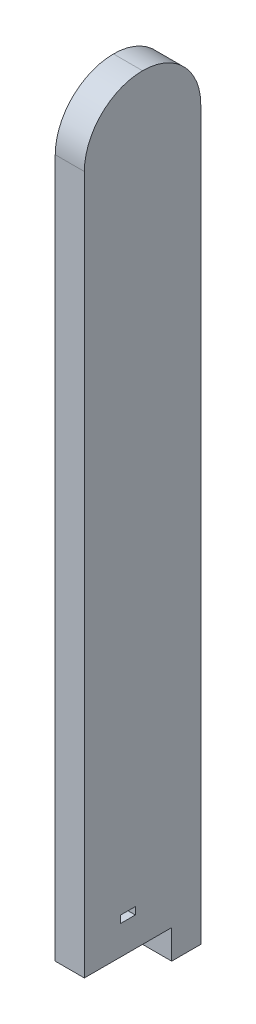
ISO-10303-21;
HEADER;
FILE_DESCRIPTION(('STEP AP214'),'2;1');
FILE_NAME('part.step','',(''),(''),'','','');
FILE_SCHEMA(('AUTOMOTIVE_DESIGN { 1 0 10303 214 1 1 1 1 }'));
ENDSEC;
DATA;
#1=APPLICATION_CONTEXT('core data for automotive mechanical design processes');
#2=APPLICATION_PROTOCOL_DEFINITION('international standard','automotive_design',2000,#1);
#3=PRODUCT_CONTEXT('',#1,'mechanical');
#4=PRODUCT('Part','Part','',(#3));
#5=PRODUCT_RELATED_PRODUCT_CATEGORY('part','',(#4));
#6=PRODUCT_DEFINITION_FORMATION('','',#4);
#7=PRODUCT_DEFINITION_CONTEXT('part definition',#1,'design');
#8=PRODUCT_DEFINITION('design','',#6,#7);
#9=PRODUCT_DEFINITION_SHAPE('','',#8);
#10=(LENGTH_UNIT() NAMED_UNIT(*) SI_UNIT(.MILLI.,.METRE.));
#11=(NAMED_UNIT(*) PLANE_ANGLE_UNIT() SI_UNIT($,.RADIAN.));
#12=(NAMED_UNIT(*) SI_UNIT($,.STERADIAN.) SOLID_ANGLE_UNIT());
#13=UNCERTAINTY_MEASURE_WITH_UNIT(LENGTH_MEASURE(1.E-05),#10,'distance_accuracy_value','');
#14=(GEOMETRIC_REPRESENTATION_CONTEXT(3) GLOBAL_UNCERTAINTY_ASSIGNED_CONTEXT((#13)) GLOBAL_UNIT_ASSIGNED_CONTEXT((#10,
#11,#12)) REPRESENTATION_CONTEXT('',''));
#15=CARTESIAN_POINT('',(0.,0.,0.));
#16=DIRECTION('',(0.,0.,1.));
#17=DIRECTION('',(1.,0.,0.));
#18=AXIS2_PLACEMENT_3D('',#15,#16,#17);
#19=CARTESIAN_POINT('',(3.175,12.7000000000118,12.7));
#20=DIRECTION('',(0.,0.,-1.));
#21=DIRECTION('',(0.,1.,0.));
#22=AXIS2_PLACEMENT_3D('',#19,#20,#21);
#23=PLANE('',#22);
#24=DIRECTION('',(0.,-1.,0.));
#25=VECTOR('',#24,1.);
#26=CARTESIAN_POINT('',(3.175,12.7000000000118,12.7));
#27=LINE('',#26,#25);
#28=CARTESIAN_POINT('',(3.175,1.17943849131663E-11,12.7));
#29=VERTEX_POINT('',#28);
#30=CARTESIAN_POINT('',(3.175,-152.4,12.7));
#31=VERTEX_POINT('',#30);
#32=EDGE_CURVE('E155',#29,#31,#27,.T.);
#33=ORIENTED_EDGE('',*,*,#32,.F.);
#34=DIRECTION('',(-1.,0.,0.));
#35=VECTOR('',#34,1.);
#36=CARTESIAN_POINT('',(3.175,1.17943849131663E-11,12.7));
#37=LINE('',#36,#35);
#38=CARTESIAN_POINT('',(-3.175,1.17943849131663E-11,12.7));
#39=VERTEX_POINT('',#38);
#40=EDGE_CURVE('E11',#29,#39,#37,.T.);
#41=ORIENTED_EDGE('',*,*,#40,.T.);
#42=DIRECTION('',(0.,-1.,0.));
#43=VECTOR('',#42,1.);
#44=CARTESIAN_POINT('',(-3.175,12.7000000000118,12.7));
#45=LINE('',#44,#43);
#46=CARTESIAN_POINT('',(-3.175,-152.4,12.7));
#47=VERTEX_POINT('',#46);
#48=EDGE_CURVE('E166',#39,#47,#45,.T.);
#49=ORIENTED_EDGE('',*,*,#48,.T.);
#50=DIRECTION('',(-1.,0.,0.));
#51=VECTOR('',#50,1.);
#52=CARTESIAN_POINT('',(3.175,-152.4,12.7));
#53=LINE('',#52,#51);
#54=EDGE_CURVE('E184',#31,#47,#53,.T.);
#55=ORIENTED_EDGE('',*,*,#54,.F.);
#56=EDGE_LOOP('',(#33,#41,#49,#55));
#57=FACE_BOUND('',#56,.T.);
#58=ADVANCED_FACE('F33',(#57),#23,.F.);
#59=CARTESIAN_POINT('',(3.175,-152.4,12.7));
#60=DIRECTION('',(0.,1.,0.));
#61=DIRECTION('',(0.,0.,1.));
#62=AXIS2_PLACEMENT_3D('',#59,#60,#61);
#63=PLANE('',#62);
#64=DIRECTION('',(0.,0.,-1.));
#65=VECTOR('',#64,1.);
#66=CARTESIAN_POINT('',(-3.175,-152.4,12.7));
#67=LINE('',#66,#65);
#68=CARTESIAN_POINT('',(-3.175,-152.4,-6.35000000000002));
#69=VERTEX_POINT('',#68);
#70=EDGE_CURVE('E168',#47,#69,#67,.T.);
#71=ORIENTED_EDGE('',*,*,#70,.T.);
#72=DIRECTION('',(-1.,0.,0.));
#73=VECTOR('',#72,1.);
#74=CARTESIAN_POINT('',(3.175,-152.4,-6.35000000000002));
#75=LINE('',#74,#73);
#76=CARTESIAN_POINT('',(3.175,-152.4,-6.35000000000002));
#77=VERTEX_POINT('',#76);
#78=EDGE_CURVE('E181',#77,#69,#75,.T.);
#79=ORIENTED_EDGE('',*,*,#78,.F.);
#80=DIRECTION('',(0.,0.,-1.));
#81=VECTOR('',#80,1.);
#82=CARTESIAN_POINT('',(3.175,-152.4,12.7));
#83=LINE('',#82,#81);
#84=EDGE_CURVE('E158',#31,#77,#83,.T.);
#85=ORIENTED_EDGE('',*,*,#84,.F.);
#86=ORIENTED_EDGE('',*,*,#54,.T.);
#87=EDGE_LOOP('',(#71,#79,#85,#86));
#88=FACE_BOUND('',#87,.T.);
#89=ADVANCED_FACE('F227',(#88),#63,.F.);
#90=CARTESIAN_POINT('',(3.175,-158.75,-6.35000000000002));
#91=DIRECTION('',(0.,0.,-1.));
#92=DIRECTION('',(0.,1.,0.));
#93=AXIS2_PLACEMENT_3D('',#90,#91,#92);
#94=PLANE('',#93);
#95=DIRECTION('',(0.,-1.,0.));
#96=VECTOR('',#95,1.);
#97=CARTESIAN_POINT('',(-3.175,-158.75,-6.35000000000002));
#98=LINE('',#97,#96);
#99=CARTESIAN_POINT('',(-3.175,-158.75,-6.35000000000002));
#100=VERTEX_POINT('',#99);
#101=EDGE_CURVE('E170',#69,#100,#98,.T.);
#102=ORIENTED_EDGE('',*,*,#101,.T.);
#103=DIRECTION('',(-1.,0.,0.));
#104=VECTOR('',#103,1.);
#105=CARTESIAN_POINT('',(3.175,-158.75,-6.35000000000002));
#106=LINE('',#105,#104);
#107=CARTESIAN_POINT('',(3.175,-158.75,-6.35000000000002));
#108=VERTEX_POINT('',#107);
#109=EDGE_CURVE('E178',#108,#100,#106,.T.);
#110=ORIENTED_EDGE('',*,*,#109,.F.);
#111=DIRECTION('',(0.,-1.,0.));
#112=VECTOR('',#111,1.);
#113=CARTESIAN_POINT('',(3.175,-158.75,-6.35000000000002));
#114=LINE('',#113,#112);
#115=EDGE_CURVE('E160',#77,#108,#114,.T.);
#116=ORIENTED_EDGE('',*,*,#115,.F.);
#117=ORIENTED_EDGE('',*,*,#78,.T.);
#118=EDGE_LOOP('',(#102,#110,#116,#117));
#119=FACE_BOUND('',#118,.T.);
#120=ADVANCED_FACE('F222',(#119),#94,.F.);
#121=CARTESIAN_POINT('',(3.175,-158.75,-12.7));
#122=DIRECTION('',(0.,1.,0.));
#123=DIRECTION('',(0.,0.,1.));
#124=AXIS2_PLACEMENT_3D('',#121,#122,#123);
#125=PLANE('',#124);
#126=DIRECTION('',(0.,0.,-1.));
#127=VECTOR('',#126,1.);
#128=CARTESIAN_POINT('',(-3.175,-158.75,-12.7));
#129=LINE('',#128,#127);
#130=CARTESIAN_POINT('',(-3.175,-158.75,-12.7));
#131=VERTEX_POINT('',#130);
#132=EDGE_CURVE('E172',#100,#131,#129,.T.);
#133=ORIENTED_EDGE('',*,*,#132,.T.);
#134=DIRECTION('',(-1.,0.,0.));
#135=VECTOR('',#134,1.);
#136=CARTESIAN_POINT('',(3.175,-158.75,-12.7));
#137=LINE('',#136,#135);
#138=CARTESIAN_POINT('',(3.175,-158.75,-12.7));
#139=VERTEX_POINT('',#138);
#140=EDGE_CURVE('E165',#139,#131,#137,.T.);
#141=ORIENTED_EDGE('',*,*,#140,.F.);
#142=DIRECTION('',(0.,0.,-1.));
#143=VECTOR('',#142,1.);
#144=CARTESIAN_POINT('',(3.175,-158.75,-12.7));
#145=LINE('',#144,#143);
#146=EDGE_CURVE('E162',#108,#139,#145,.T.);
#147=ORIENTED_EDGE('',*,*,#146,.F.);
#148=ORIENTED_EDGE('',*,*,#109,.T.);
#149=EDGE_LOOP('',(#133,#141,#147,#148));
#150=FACE_BOUND('',#149,.T.);
#151=ADVANCED_FACE('F217',(#150),#125,.F.);
#152=CARTESIAN_POINT('',(3.175,-69.5375518201732,-12.7));
#153=DIRECTION('',(0.,0.,1.));
#154=DIRECTION('',(0.,-1.,0.));
#155=AXIS2_PLACEMENT_3D('',#152,#153,#154);
#156=PLANE('',#155);
#157=DIRECTION('',(0.,1.,0.));
#158=VECTOR('',#157,1.);
#159=CARTESIAN_POINT('',(-3.175,-69.5375518201732,-12.7));
#160=LINE('',#159,#158);
#161=CARTESIAN_POINT('',(-3.175,1.17961196366423E-11,-12.7));
#162=VERTEX_POINT('',#161);
#163=EDGE_CURVE('E156',#131,#162,#160,.T.);
#164=ORIENTED_EDGE('',*,*,#163,.T.);
#165=DIRECTION('',(-1.,0.,0.));
#166=VECTOR('',#165,1.);
#167=CARTESIAN_POINT('',(3.175,1.17961196366423E-11,-12.7));
#168=LINE('',#167,#166);
#169=CARTESIAN_POINT('',(3.175,1.17978543601183E-11,-12.7));
#170=VERTEX_POINT('',#169);
#171=EDGE_CURVE('E191',#162,#170,#168,.F.);
#172=ORIENTED_EDGE('',*,*,#171,.T.);
#173=DIRECTION('',(0.,1.,0.));
#174=VECTOR('',#173,1.);
#175=CARTESIAN_POINT('',(3.175,12.7000000000118,-12.7));
#176=LINE('',#175,#174);
#177=EDGE_CURVE('E152',#139,#170,#176,.T.);
#178=ORIENTED_EDGE('',*,*,#177,.F.);
#179=ORIENTED_EDGE('',*,*,#140,.T.);
#180=EDGE_LOOP('',(#164,#172,#178,#179));
#181=FACE_BOUND('',#180,.T.);
#182=ADVANCED_FACE('F213',(#181),#156,.F.);
#183=CARTESIAN_POINT('',(3.175,0.,0.));
#184=DIRECTION('',(-1.,0.,0.));
#185=DIRECTION('',(0.,0.,1.));
#186=AXIS2_PLACEMENT_3D('',#183,#184,#185);
#187=PLANE('',#186);
#188=DIRECTION('',(0.,0.,1.));
#189=VECTOR('',#188,1.);
#190=CARTESIAN_POINT('',(3.175,-144.4625,4.76249999999997));
#191=LINE('',#190,#189);
#192=CARTESIAN_POINT('',(3.175,-144.4625,1.58749999999997));
#193=VERTEX_POINT('',#192);
#194=CARTESIAN_POINT('',(3.175,-144.4625,4.76249999999997));
#195=VERTEX_POINT('',#194);
#196=EDGE_CURVE('E143',#193,#195,#191,.T.);
#197=ORIENTED_EDGE('',*,*,#196,.F.);
#198=DIRECTION('',(0.,1.,0.));
#199=VECTOR('',#198,1.);
#200=CARTESIAN_POINT('',(3.175,-146.05,1.58749999999997));
#201=LINE('',#200,#199);
#202=CARTESIAN_POINT('',(3.175,-146.05,1.58749999999997));
#203=VERTEX_POINT('',#202);
#204=EDGE_CURVE('E49',#203,#193,#201,.T.);
#205=ORIENTED_EDGE('',*,*,#204,.F.);
#206=DIRECTION('',(0.,0.,-1.));
#207=VECTOR('',#206,1.);
#208=CARTESIAN_POINT('',(3.175,-146.05,4.76249999999997));
#209=LINE('',#208,#207);
#210=CARTESIAN_POINT('',(3.175,-146.05,4.76249999999997));
#211=VERTEX_POINT('',#210);
#212=EDGE_CURVE('E134',#211,#203,#209,.T.);
#213=ORIENTED_EDGE('',*,*,#212,.F.);
#214=DIRECTION('',(0.,-1.,0.));
#215=VECTOR('',#214,1.);
#216=CARTESIAN_POINT('',(3.175,-146.05,4.76249999999997));
#217=LINE('',#216,#215);
#218=EDGE_CURVE('E137',#195,#211,#217,.T.);
#219=ORIENTED_EDGE('',*,*,#218,.F.);
#220=EDGE_LOOP('',(#197,#205,#213,#219));
#221=FACE_BOUND('',#220,.T.);
#222=ORIENTED_EDGE('',*,*,#177,.T.);
#223=CARTESIAN_POINT('',(3.175,1.17961196366423E-11,0.));
#224=DIRECTION('',(-1.,0.,0.));
#225=DIRECTION('',(0.,0.,1.));
#226=AXIS2_PLACEMENT_3D('',#223,#224,#225);
#227=CIRCLE('',#226,12.7);
#228=CARTESIAN_POINT('',(3.175,12.7000000000118,0.));
#229=VERTEX_POINT('',#228);
#230=EDGE_CURVE('E42',#170,#229,#227,.F.);
#231=ORIENTED_EDGE('',*,*,#230,.T.);
#232=CARTESIAN_POINT('',(3.175,1.17961196366423E-11,0.));
#233=DIRECTION('',(-1.,0.,0.));
#234=DIRECTION('',(0.,0.,1.));
#235=AXIS2_PLACEMENT_3D('',#232,#233,#234);
#236=CIRCLE('',#235,12.7);
#237=EDGE_CURVE('E194',#229,#29,#236,.F.);
#238=ORIENTED_EDGE('',*,*,#237,.T.);
#239=ORIENTED_EDGE('',*,*,#32,.T.);
#240=ORIENTED_EDGE('',*,*,#84,.T.);
#241=ORIENTED_EDGE('',*,*,#115,.T.);
#242=ORIENTED_EDGE('',*,*,#146,.T.);
#243=EDGE_LOOP('',(#222,#231,#238,#239,#240,#241,#242));
#244=FACE_BOUND('',#243,.T.);
#245=ADVANCED_FACE('F198',(#221,#244),#187,.F.);
#246=CARTESIAN_POINT('',(-3.175,0.,0.));
#247=DIRECTION('',(-1.,0.,0.));
#248=DIRECTION('',(0.,0.,1.));
#249=AXIS2_PLACEMENT_3D('',#246,#247,#248);
#250=PLANE('',#249);
#251=DIRECTION('',(0.,1.,0.));
#252=VECTOR('',#251,1.);
#253=CARTESIAN_POINT('',(-3.175,-146.05,1.58749999999997));
#254=LINE('',#253,#252);
#255=CARTESIAN_POINT('',(-3.175,-146.05,1.58749999999997));
#256=VERTEX_POINT('',#255);
#257=CARTESIAN_POINT('',(-3.175,-144.4625,1.58749999999997));
#258=VERTEX_POINT('',#257);
#259=EDGE_CURVE('E118',#256,#258,#254,.T.);
#260=ORIENTED_EDGE('',*,*,#259,.T.);
#261=DIRECTION('',(0.,0.,1.));
#262=VECTOR('',#261,1.);
#263=CARTESIAN_POINT('',(-3.175,-144.4625,4.76249999999997));
#264=LINE('',#263,#262);
#265=CARTESIAN_POINT('',(-3.175,-144.4625,4.76249999999997));
#266=VERTEX_POINT('',#265);
#267=EDGE_CURVE('E127',#258,#266,#264,.T.);
#268=ORIENTED_EDGE('',*,*,#267,.T.);
#269=DIRECTION('',(0.,-1.,0.));
#270=VECTOR('',#269,1.);
#271=CARTESIAN_POINT('',(-3.175,-146.05,4.76249999999997));
#272=LINE('',#271,#270);
#273=CARTESIAN_POINT('',(-3.175,-146.05,4.76249999999997));
#274=VERTEX_POINT('',#273);
#275=EDGE_CURVE('E57',#266,#274,#272,.T.);
#276=ORIENTED_EDGE('',*,*,#275,.T.);
#277=DIRECTION('',(0.,0.,-1.));
#278=VECTOR('',#277,1.);
#279=CARTESIAN_POINT('',(-3.175,-146.05,4.76249999999997));
#280=LINE('',#279,#278);
#281=EDGE_CURVE('E124',#274,#256,#280,.T.);
#282=ORIENTED_EDGE('',*,*,#281,.T.);
#283=EDGE_LOOP('',(#260,#268,#276,#282));
#284=FACE_BOUND('',#283,.T.);
#285=CARTESIAN_POINT('',(-3.175,1.17961196366423E-11,0.));
#286=DIRECTION('',(-1.,0.,0.));
#287=DIRECTION('',(0.,0.,1.));
#288=AXIS2_PLACEMENT_3D('',#285,#286,#287);
#289=CIRCLE('',#288,12.7);
#290=CARTESIAN_POINT('',(-3.175,12.7000000000118,0.));
#291=VERTEX_POINT('',#290);
#292=EDGE_CURVE('E187',#39,#291,#289,.T.);
#293=ORIENTED_EDGE('',*,*,#292,.T.);
#294=CARTESIAN_POINT('',(-3.175,1.17961196366423E-11,0.));
#295=DIRECTION('',(-1.,0.,0.));
#296=DIRECTION('',(0.,0.,1.));
#297=AXIS2_PLACEMENT_3D('',#294,#295,#296);
#298=CIRCLE('',#297,12.7);
#299=EDGE_CURVE('E189',#291,#162,#298,.T.);
#300=ORIENTED_EDGE('',*,*,#299,.T.);
#301=ORIENTED_EDGE('',*,*,#163,.F.);
#302=ORIENTED_EDGE('',*,*,#132,.F.);
#303=ORIENTED_EDGE('',*,*,#101,.F.);
#304=ORIENTED_EDGE('',*,*,#70,.F.);
#305=ORIENTED_EDGE('',*,*,#48,.F.);
#306=EDGE_LOOP('',(#293,#300,#301,#302,#303,#304,#305));
#307=FACE_BOUND('',#306,.T.);
#308=ADVANCED_FACE('F131',(#284,#307),#250,.T.);
#309=CARTESIAN_POINT('',(3.175,1.17961196366423E-11,0.));
#310=DIRECTION('',(-1.,0.,0.));
#311=DIRECTION('',(0.,0.,1.));
#312=AXIS2_PLACEMENT_3D('',#309,#310,#311);
#313=CYLINDRICAL_SURFACE('',#312,12.7);
#314=ORIENTED_EDGE('',*,*,#40,.F.);
#315=ORIENTED_EDGE('',*,*,#237,.F.);
#316=DIRECTION('',(-1.,0.,0.));
#317=VECTOR('',#316,1.);
#318=CARTESIAN_POINT('',(3.175,12.7000000000118,0.));
#319=LINE('',#318,#317);
#320=EDGE_CURVE('E37',#291,#229,#319,.F.);
#321=ORIENTED_EDGE('',*,*,#320,.F.);
#322=ORIENTED_EDGE('',*,*,#292,.F.);
#323=EDGE_LOOP('',(#314,#315,#321,#322));
#324=FACE_BOUND('',#323,.T.);
#325=ADVANCED_FACE('F35',(#324),#313,.T.);
#326=CARTESIAN_POINT('',(3.175,1.17961196366423E-11,0.));
#327=DIRECTION('',(-1.,0.,0.));
#328=DIRECTION('',(0.,0.,1.));
#329=AXIS2_PLACEMENT_3D('',#326,#327,#328);
#330=CYLINDRICAL_SURFACE('',#329,12.7);
#331=ORIENTED_EDGE('',*,*,#230,.F.);
#332=ORIENTED_EDGE('',*,*,#171,.F.);
#333=ORIENTED_EDGE('',*,*,#299,.F.);
#334=ORIENTED_EDGE('',*,*,#320,.T.);
#335=EDGE_LOOP('',(#331,#332,#333,#334));
#336=FACE_BOUND('',#335,.T.);
#337=ADVANCED_FACE('F208',(#336),#330,.T.);
#338=CARTESIAN_POINT('',(-3.175,-146.05,1.58749999999997));
#339=DIRECTION('',(0.,0.,-1.));
#340=DIRECTION('',(-1.,0.,0.));
#341=AXIS2_PLACEMENT_3D('',#338,#339,#340);
#342=PLANE('',#341);
#343=ORIENTED_EDGE('',*,*,#204,.T.);
#344=DIRECTION('',(1.,0.,0.));
#345=VECTOR('',#344,1.);
#346=CARTESIAN_POINT('',(-3.175,-144.4625,1.58749999999997));
#347=LINE('',#346,#345);
#348=EDGE_CURVE('E114',#258,#193,#347,.T.);
#349=ORIENTED_EDGE('',*,*,#348,.F.);
#350=ORIENTED_EDGE('',*,*,#259,.F.);
#351=DIRECTION('',(1.,0.,0.));
#352=VECTOR('',#351,1.);
#353=CARTESIAN_POINT('',(-3.175,-146.05,1.58749999999997));
#354=LINE('',#353,#352);
#355=EDGE_CURVE('E147',#256,#203,#354,.T.);
#356=ORIENTED_EDGE('',*,*,#355,.T.);
#357=EDGE_LOOP('',(#343,#349,#350,#356));
#358=FACE_BOUND('',#357,.T.);
#359=ADVANCED_FACE('F116',(#358),#342,.F.);
#360=CARTESIAN_POINT('',(-3.175,-146.05,4.76249999999997));
#361=DIRECTION('',(0.,-1.,0.));
#362=DIRECTION('',(0.,0.,-1.));
#363=AXIS2_PLACEMENT_3D('',#360,#361,#362);
#364=PLANE('',#363);
#365=ORIENTED_EDGE('',*,*,#212,.T.);
#366=ORIENTED_EDGE('',*,*,#355,.F.);
#367=ORIENTED_EDGE('',*,*,#281,.F.);
#368=DIRECTION('',(1.,0.,0.));
#369=VECTOR('',#368,1.);
#370=CARTESIAN_POINT('',(-3.175,-146.05,4.76249999999997));
#371=LINE('',#370,#369);
#372=EDGE_CURVE('E149',#274,#211,#371,.T.);
#373=ORIENTED_EDGE('',*,*,#372,.T.);
#374=EDGE_LOOP('',(#365,#366,#367,#373));
#375=FACE_BOUND('',#374,.T.);
#376=ADVANCED_FACE('F242',(#375),#364,.F.);
#377=CARTESIAN_POINT('',(-3.175,-146.05,4.76249999999997));
#378=DIRECTION('',(0.,0.,1.));
#379=DIRECTION('',(1.,0.,0.));
#380=AXIS2_PLACEMENT_3D('',#377,#378,#379);
#381=PLANE('',#380);
#382=ORIENTED_EDGE('',*,*,#218,.T.);
#383=ORIENTED_EDGE('',*,*,#372,.F.);
#384=ORIENTED_EDGE('',*,*,#275,.F.);
#385=DIRECTION('',(1.,0.,0.));
#386=VECTOR('',#385,1.);
#387=CARTESIAN_POINT('',(-3.175,-144.4625,4.76249999999997));
#388=LINE('',#387,#386);
#389=EDGE_CURVE('E123',#266,#195,#388,.T.);
#390=ORIENTED_EDGE('',*,*,#389,.T.);
#391=EDGE_LOOP('',(#382,#383,#384,#390));
#392=FACE_BOUND('',#391,.T.);
#393=ADVANCED_FACE('F296',(#392),#381,.F.);
#394=CARTESIAN_POINT('',(-3.175,-144.4625,4.76249999999997));
#395=DIRECTION('',(0.,1.,0.));
#396=DIRECTION('',(0.,0.,1.));
#397=AXIS2_PLACEMENT_3D('',#394,#395,#396);
#398=PLANE('',#397);
#399=ORIENTED_EDGE('',*,*,#196,.T.);
#400=ORIENTED_EDGE('',*,*,#389,.F.);
#401=ORIENTED_EDGE('',*,*,#267,.F.);
#402=ORIENTED_EDGE('',*,*,#348,.T.);
#403=EDGE_LOOP('',(#399,#400,#401,#402));
#404=FACE_BOUND('',#403,.T.);
#405=ADVANCED_FACE('F128',(#404),#398,.F.);
#406=CLOSED_SHELL('',(#58,#89,#120,#151,#182,#245,#308,#325,#337,#359,#376,#393,#405));
#407=MANIFOLD_SOLID_BREP('B2',#406);
#408=ADVANCED_BREP_SHAPE_REPRESENTATION('',(#18,#407),#14);
#409=SHAPE_DEFINITION_REPRESENTATION(#9,#408);
ENDSEC;
END-ISO-10303-21;
